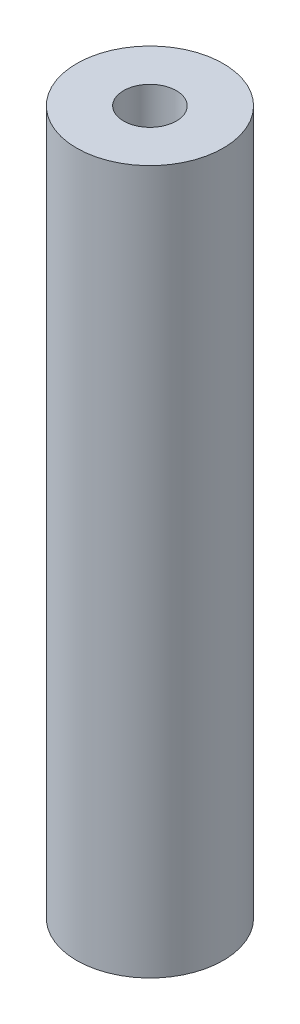
ISO-10303-21;
HEADER;
FILE_DESCRIPTION(('STEP AP214'),'2;1');
FILE_NAME('part.step','',(''),(''),'','','');
FILE_SCHEMA(('AUTOMOTIVE_DESIGN { 1 0 10303 214 1 1 1 1 }'));
ENDSEC;
DATA;
#1=APPLICATION_CONTEXT('core data for automotive mechanical design processes');
#2=APPLICATION_PROTOCOL_DEFINITION('international standard','automotive_design',2000,#1);
#3=PRODUCT_CONTEXT('',#1,'mechanical');
#4=PRODUCT('Part','Part','',(#3));
#5=PRODUCT_RELATED_PRODUCT_CATEGORY('part','',(#4));
#6=PRODUCT_DEFINITION_FORMATION('','',#4);
#7=PRODUCT_DEFINITION_CONTEXT('part definition',#1,'design');
#8=PRODUCT_DEFINITION('design','',#6,#7);
#9=PRODUCT_DEFINITION_SHAPE('','',#8);
#10=(LENGTH_UNIT() NAMED_UNIT(*) SI_UNIT(.MILLI.,.METRE.));
#11=(NAMED_UNIT(*) PLANE_ANGLE_UNIT() SI_UNIT($,.RADIAN.));
#12=(NAMED_UNIT(*) SI_UNIT($,.STERADIAN.) SOLID_ANGLE_UNIT());
#13=UNCERTAINTY_MEASURE_WITH_UNIT(LENGTH_MEASURE(1.E-05),#10,'distance_accuracy_value','');
#14=(GEOMETRIC_REPRESENTATION_CONTEXT(3) GLOBAL_UNCERTAINTY_ASSIGNED_CONTEXT((#13)) GLOBAL_UNIT_ASSIGNED_CONTEXT((#10,
#11,#12)) REPRESENTATION_CONTEXT('',''));
#15=CARTESIAN_POINT('',(0.,0.,0.));
#16=DIRECTION('',(0.,0.,1.));
#17=DIRECTION('',(1.,0.,0.));
#18=AXIS2_PLACEMENT_3D('',#15,#16,#17);
#19=CARTESIAN_POINT('',(0.,24.,0.));
#20=DIRECTION('',(0.,1.,0.));
#21=DIRECTION('',(0.,0.,1.));
#22=AXIS2_PLACEMENT_3D('',#19,#20,#21);
#23=PLANE('',#22);
#24=CARTESIAN_POINT('',(0.,24.,0.));
#25=DIRECTION('',(0.,1.,0.));
#26=DIRECTION('',(0.,0.,1.));
#27=AXIS2_PLACEMENT_3D('',#24,#25,#26);
#28=CIRCLE('',#27,2.5);
#29=CARTESIAN_POINT('',(0.,24.,2.5));
#30=VERTEX_POINT('',#29);
#31=EDGE_CURVE('E11',#30,#30,#28,.T.);
#32=ORIENTED_EDGE('',*,*,#31,.T.);
#33=EDGE_LOOP('',(#32));
#34=FACE_BOUND('',#33,.T.);
#35=CARTESIAN_POINT('',(0.,24.,0.));
#36=DIRECTION('',(0.,1.,0.));
#37=DIRECTION('',(0.,0.,1.));
#38=AXIS2_PLACEMENT_3D('',#35,#36,#37);
#39=CIRCLE('',#38,0.9);
#40=CARTESIAN_POINT('',(0.,24.,0.9));
#41=VERTEX_POINT('',#40);
#42=EDGE_CURVE('E54',#41,#41,#39,.T.);
#43=ORIENTED_EDGE('',*,*,#42,.F.);
#44=EDGE_LOOP('',(#43));
#45=FACE_BOUND('',#44,.T.);
#46=ADVANCED_FACE('F43',(#34,#45),#23,.T.);
#47=CARTESIAN_POINT('',(0.,0.,0.));
#48=DIRECTION('',(0.,1.,0.));
#49=DIRECTION('',(0.,0.,1.));
#50=AXIS2_PLACEMENT_3D('',#47,#48,#49);
#51=PLANE('',#50);
#52=CARTESIAN_POINT('',(0.,0.,0.));
#53=DIRECTION('',(0.,1.,0.));
#54=DIRECTION('',(0.,0.,1.));
#55=AXIS2_PLACEMENT_3D('',#52,#53,#54);
#56=CIRCLE('',#55,2.5);
#57=CARTESIAN_POINT('',(0.,0.,2.5));
#58=VERTEX_POINT('',#57);
#59=EDGE_CURVE('E47',#58,#58,#56,.T.);
#60=ORIENTED_EDGE('',*,*,#59,.F.);
#61=EDGE_LOOP('',(#60));
#62=FACE_BOUND('',#61,.T.);
#63=CARTESIAN_POINT('',(0.,0.,0.));
#64=DIRECTION('',(0.,1.,0.));
#65=DIRECTION('',(0.,0.,1.));
#66=AXIS2_PLACEMENT_3D('',#63,#64,#65);
#67=CIRCLE('',#66,0.9);
#68=CARTESIAN_POINT('',(0.,0.,0.9));
#69=VERTEX_POINT('',#68);
#70=EDGE_CURVE('E56',#69,#69,#67,.T.);
#71=ORIENTED_EDGE('',*,*,#70,.T.);
#72=EDGE_LOOP('',(#71));
#73=FACE_BOUND('',#72,.T.);
#74=ADVANCED_FACE('F66',(#62,#73),#51,.F.);
#75=CARTESIAN_POINT('',(0.,24.,0.));
#76=DIRECTION('',(0.,-1.,0.));
#77=DIRECTION('',(0.,0.,-1.));
#78=AXIS2_PLACEMENT_3D('',#75,#76,#77);
#79=CYLINDRICAL_SURFACE('',#78,2.5);
#80=ORIENTED_EDGE('',*,*,#31,.F.);
#81=EDGE_LOOP('',(#80));
#82=FACE_BOUND('',#81,.T.);
#83=ORIENTED_EDGE('',*,*,#59,.T.);
#84=EDGE_LOOP('',(#83));
#85=FACE_BOUND('',#84,.T.);
#86=ADVANCED_FACE('F45',(#82,#85),#79,.T.);
#87=CARTESIAN_POINT('',(0.,24.,0.));
#88=DIRECTION('',(0.,-1.,0.));
#89=DIRECTION('',(0.,0.,-1.));
#90=AXIS2_PLACEMENT_3D('',#87,#88,#89);
#91=CYLINDRICAL_SURFACE('',#90,0.9);
#92=ORIENTED_EDGE('',*,*,#42,.T.);
#93=EDGE_LOOP('',(#92));
#94=FACE_BOUND('',#93,.T.);
#95=ORIENTED_EDGE('',*,*,#70,.F.);
#96=EDGE_LOOP('',(#95));
#97=FACE_BOUND('',#96,.T.);
#98=ADVANCED_FACE('F62',(#94,#97),#91,.F.);
#99=CLOSED_SHELL('',(#46,#74,#86,#98));
#100=MANIFOLD_SOLID_BREP('B2',#99);
#101=ADVANCED_BREP_SHAPE_REPRESENTATION('',(#18,#100),#14);
#102=SHAPE_DEFINITION_REPRESENTATION(#9,#101);
ENDSEC;
END-ISO-10303-21;
